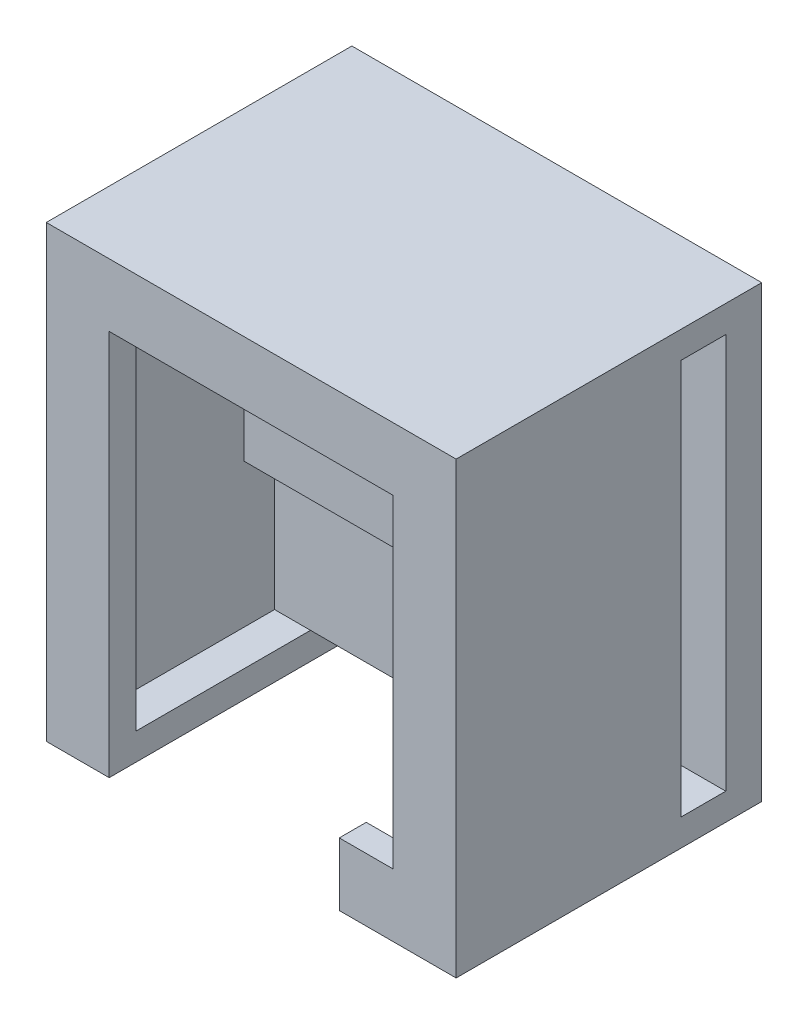
ISO-10303-21;
HEADER;
FILE_DESCRIPTION(('STEP AP214'),'2;1');
FILE_NAME('part.step','',(''),(''),'','','');
FILE_SCHEMA(('AUTOMOTIVE_DESIGN { 1 0 10303 214 1 1 1 1 }'));
ENDSEC;
DATA;
#1=APPLICATION_CONTEXT('core data for automotive mechanical design processes');
#2=APPLICATION_PROTOCOL_DEFINITION('international standard','automotive_design',2000,#1);
#3=PRODUCT_CONTEXT('',#1,'mechanical');
#4=PRODUCT('Part','Part','',(#3));
#5=PRODUCT_RELATED_PRODUCT_CATEGORY('part','',(#4));
#6=PRODUCT_DEFINITION_FORMATION('','',#4);
#7=PRODUCT_DEFINITION_CONTEXT('part definition',#1,'design');
#8=PRODUCT_DEFINITION('design','',#6,#7);
#9=PRODUCT_DEFINITION_SHAPE('','',#8);
#10=(LENGTH_UNIT() NAMED_UNIT(*) SI_UNIT(.MILLI.,.METRE.));
#11=(NAMED_UNIT(*) PLANE_ANGLE_UNIT() SI_UNIT($,.RADIAN.));
#12=(NAMED_UNIT(*) SI_UNIT($,.STERADIAN.) SOLID_ANGLE_UNIT());
#13=UNCERTAINTY_MEASURE_WITH_UNIT(LENGTH_MEASURE(1.E-05),#10,'distance_accuracy_value','');
#14=(GEOMETRIC_REPRESENTATION_CONTEXT(3) GLOBAL_UNCERTAINTY_ASSIGNED_CONTEXT((#13)) GLOBAL_UNIT_ASSIGNED_CONTEXT((#10,
#11,#12)) REPRESENTATION_CONTEXT('',''));
#15=CARTESIAN_POINT('',(0.,0.,0.));
#16=DIRECTION('',(0.,0.,1.));
#17=DIRECTION('',(1.,0.,0.));
#18=AXIS2_PLACEMENT_3D('',#15,#16,#17);
#19=CARTESIAN_POINT('',(-75.3066025977012,-5.31800766283525,3.));
#20=DIRECTION('',(0.,1.,0.));
#21=DIRECTION('',(0.,0.,1.));
#22=AXIS2_PLACEMENT_3D('',#19,#20,#21);
#23=PLANE('',#22);
#24=DIRECTION('',(0.,0.,1.));
#25=VECTOR('',#24,1.);
#26=CARTESIAN_POINT('',(-63.2066025977012,-5.31800766283525,11.));
#27=LINE('',#26,#25);
#28=CARTESIAN_POINT('',(-63.2066025977012,-5.31800766283527,0.));
#29=VERTEX_POINT('',#28);
#30=CARTESIAN_POINT('',(-63.2066025977012,-5.31800766283525,1.3));
#31=VERTEX_POINT('',#30);
#32=EDGE_CURVE('E352',#29,#31,#27,.T.);
#33=ORIENTED_EDGE('',*,*,#32,.F.);
#34=DIRECTION('',(1.,0.,0.));
#35=VECTOR('',#34,1.);
#36=CARTESIAN_POINT('',(-66.7066025977012,-5.31800766283527,0.));
#37=LINE('',#36,#35);
#38=CARTESIAN_POINT('',(-50.4066025977012,-5.31800766283526,0.));
#39=VERTEX_POINT('',#38);
#40=EDGE_CURVE('E214',#29,#39,#37,.T.);
#41=ORIENTED_EDGE('',*,*,#40,.T.);
#42=DIRECTION('',(0.,0.,-1.));
#43=VECTOR('',#42,1.);
#44=CARTESIAN_POINT('',(-50.4066025977012,-5.31800766283525,11.));
#45=LINE('',#44,#43);
#46=CARTESIAN_POINT('',(-50.4066025977012,-5.31800766283525,3.));
#47=VERTEX_POINT('',#46);
#48=EDGE_CURVE('E339',#47,#39,#45,.T.);
#49=ORIENTED_EDGE('',*,*,#48,.F.);
#50=DIRECTION('',(1.,0.,0.));
#51=VECTOR('',#50,1.);
#52=CARTESIAN_POINT('',(-75.3066025977012,-5.31800766283525,3.));
#53=LINE('',#52,#51);
#54=CARTESIAN_POINT('',(-52.2066025977012,-5.31800766283525,3.));
#55=VERTEX_POINT('',#54);
#56=EDGE_CURVE('E11',#55,#47,#53,.T.);
#57=ORIENTED_EDGE('',*,*,#56,.F.);
#58=DIRECTION('',(0.,0.,1.));
#59=VECTOR('',#58,1.);
#60=CARTESIAN_POINT('',(-52.2066025977012,-5.31800766283525,3.));
#61=LINE('',#60,#59);
#62=CARTESIAN_POINT('',(-52.2066025977012,-5.31800766283525,1.3));
#63=VERTEX_POINT('',#62);
#64=EDGE_CURVE('E359',#63,#55,#61,.T.);
#65=ORIENTED_EDGE('',*,*,#64,.F.);
#66=DIRECTION('',(1.,0.,0.));
#67=VECTOR('',#66,1.);
#68=CARTESIAN_POINT('',(-65.2066025977012,-5.31800766283525,1.3));
#69=LINE('',#68,#67);
#70=EDGE_CURVE('E348',#31,#63,#69,.T.);
#71=ORIENTED_EDGE('',*,*,#70,.F.);
#72=EDGE_LOOP('',(#33,#41,#49,#57,#65,#71));
#73=FACE_BOUND('',#72,.T.);
#74=ADVANCED_FACE('F33',(#73),#23,.F.);
#75=CARTESIAN_POINT('',(-50.4066025977012,-5.31800766283525,-2.5));
#76=VERTEX_POINT('',#75);
#77=CARTESIAN_POINT('',(-50.4066025977012,-5.31800766283525,-4.5));
#78=VERTEX_POINT('',#77);
#79=EDGE_CURVE('E336',#76,#78,#45,.T.);
#80=ORIENTED_EDGE('',*,*,#79,.F.);
#81=DIRECTION('',(1.,0.,0.));
#82=VECTOR('',#81,1.);
#83=CARTESIAN_POINT('',(-66.7066025977012,-5.31800766283527,-2.5));
#84=LINE('',#83,#82);
#85=CARTESIAN_POINT('',(-63.2066025977012,-5.31800766283527,-2.5));
#86=VERTEX_POINT('',#85);
#87=EDGE_CURVE('E249',#86,#76,#84,.T.);
#88=ORIENTED_EDGE('',*,*,#87,.F.);
#89=CARTESIAN_POINT('',(-63.2066025977012,-5.31800766283525,-4.5));
#90=VERTEX_POINT('',#89);
#91=EDGE_CURVE('E349',#90,#86,#27,.T.);
#92=ORIENTED_EDGE('',*,*,#91,.F.);
#93=DIRECTION('',(-1.,0.,0.));
#94=VECTOR('',#93,1.);
#95=CARTESIAN_POINT('',(-50.4066025977012,-5.31800766283525,-4.5));
#96=LINE('',#95,#94);
#97=EDGE_CURVE('E268',#78,#90,#96,.T.);
#98=ORIENTED_EDGE('',*,*,#97,.F.);
#99=EDGE_LOOP('',(#80,#88,#92,#98));
#100=FACE_BOUND('',#99,.T.);
#101=ADVANCED_FACE('F35',(#100),#23,.F.);
#102=CARTESIAN_POINT('',(-37.3066025977012,17.9596174955491,3.));
#103=DIRECTION('',(0.,0.,-1.));
#104=DIRECTION('',(-1.,0.,0.));
#105=AXIS2_PLACEMENT_3D('',#102,#103,#104);
#106=PLANE('',#105);
#107=DIRECTION('',(-1.,0.,0.));
#108=VECTOR('',#107,1.);
#109=CARTESIAN_POINT('',(-65.2066025977012,2.68199233716475,3.));
#110=LINE('',#109,#108);
#111=CARTESIAN_POINT('',(-52.2066025977012,2.68199233716475,3.));
#112=VERTEX_POINT('',#111);
#113=CARTESIAN_POINT('',(-65.2066025977012,2.68199233716475,3.));
#114=VERTEX_POINT('',#113);
#115=EDGE_CURVE('E365',#112,#114,#110,.T.);
#116=ORIENTED_EDGE('',*,*,#115,.F.);
#117=DIRECTION('',(0.,-1.,0.));
#118=VECTOR('',#117,1.);
#119=CARTESIAN_POINT('',(-52.2066025977012,2.68199233716475,3.));
#120=LINE('',#119,#118);
#121=EDGE_CURVE('E372',#112,#55,#120,.T.);
#122=ORIENTED_EDGE('',*,*,#121,.T.);
#123=ORIENTED_EDGE('',*,*,#56,.T.);
#124=DIRECTION('',(1.,0.,0.));
#125=VECTOR('',#124,1.);
#126=CARTESIAN_POINT('',(-37.3066025977012,-5.31800766283525,3.));
#127=LINE('',#126,#125);
#128=CARTESIAN_POINT('',(-45.4066025977012,-5.31800766283525,3.));
#129=VERTEX_POINT('',#128);
#130=EDGE_CURVE('E333',#47,#129,#127,.T.);
#131=ORIENTED_EDGE('',*,*,#130,.T.);
#132=DIRECTION('',(0.,-1.,0.));
#133=VECTOR('',#132,1.);
#134=CARTESIAN_POINT('',(-45.4066025977012,16.6819923371647,3.));
#135=LINE('',#134,#133);
#136=CARTESIAN_POINT('',(-45.4066025977012,16.6819923371647,3.));
#137=VERTEX_POINT('',#136);
#138=EDGE_CURVE('E385',#137,#129,#135,.T.);
#139=ORIENTED_EDGE('',*,*,#138,.F.);
#140=DIRECTION('',(1.,0.,0.));
#141=VECTOR('',#140,1.);
#142=CARTESIAN_POINT('',(-65.2066025977012,16.6819923371647,3.));
#143=LINE('',#142,#141);
#144=CARTESIAN_POINT('',(-65.2066025977012,16.6819923371647,3.));
#145=VERTEX_POINT('',#144);
#146=EDGE_CURVE('E393',#145,#137,#143,.T.);
#147=ORIENTED_EDGE('',*,*,#146,.F.);
#148=DIRECTION('',(0.,1.,0.));
#149=VECTOR('',#148,1.);
#150=CARTESIAN_POINT('',(-65.2066025977012,16.6819923371647,3.));
#151=LINE('',#150,#149);
#152=EDGE_CURVE('E375',#114,#145,#151,.T.);
#153=ORIENTED_EDGE('',*,*,#152,.F.);
#154=EDGE_LOOP('',(#116,#122,#123,#131,#139,#147,#153));
#155=FACE_BOUND('',#154,.T.);
#156=ADVANCED_FACE('F438',(#155),#106,.F.);
#157=CARTESIAN_POINT('',(-66.7066025977012,-5.31800766283525,11.));
#158=DIRECTION('',(1.,0.,0.));
#159=DIRECTION('',(0.,0.,-1.));
#160=AXIS2_PLACEMENT_3D('',#157,#158,#159);
#161=PLANE('',#160);
#162=DIRECTION('',(0.,0.,1.));
#163=VECTOR('',#162,1.);
#164=CARTESIAN_POINT('',(-66.7066025977012,16.6819923371647,0.));
#165=LINE('',#164,#163);
#166=CARTESIAN_POINT('',(-66.7066025977012,16.6819923371647,-2.5));
#167=VERTEX_POINT('',#166);
#168=CARTESIAN_POINT('',(-66.7066025977012,16.6819923371647,0.));
#169=VERTEX_POINT('',#168);
#170=EDGE_CURVE('E229',#167,#169,#165,.T.);
#171=ORIENTED_EDGE('',*,*,#170,.T.);
#172=DIRECTION('',(0.,-1.,0.));
#173=VECTOR('',#172,1.);
#174=CARTESIAN_POINT('',(-66.7066025977012,-5.31800766283527,0.));
#175=LINE('',#174,#173);
#176=CARTESIAN_POINT('',(-66.7066025977012,-5.31800766283527,0.));
#177=VERTEX_POINT('',#176);
#178=EDGE_CURVE('E211',#169,#177,#175,.T.);
#179=ORIENTED_EDGE('',*,*,#178,.T.);
#180=DIRECTION('',(0.,0.,-1.));
#181=VECTOR('',#180,1.);
#182=CARTESIAN_POINT('',(-66.7066025977012,-5.31800766283527,0.));
#183=LINE('',#182,#181);
#184=CARTESIAN_POINT('',(-66.7066025977012,-5.31800766283527,-2.5));
#185=VERTEX_POINT('',#184);
#186=EDGE_CURVE('E221',#177,#185,#183,.T.);
#187=ORIENTED_EDGE('',*,*,#186,.T.);
#188=DIRECTION('',(0.,1.,0.));
#189=VECTOR('',#188,1.);
#190=CARTESIAN_POINT('',(-66.7066025977012,-5.31800766283527,-2.5));
#191=LINE('',#190,#189);
#192=EDGE_CURVE('E48',#185,#167,#191,.T.);
#193=ORIENTED_EDGE('',*,*,#192,.T.);
#194=EDGE_LOOP('',(#171,#179,#187,#193));
#195=FACE_BOUND('',#194,.T.);
#196=DIRECTION('',(0.,0.,-1.));
#197=VECTOR('',#196,1.);
#198=CARTESIAN_POINT('',(-66.7066025977012,18.1819923371647,11.));
#199=LINE('',#198,#197);
#200=CARTESIAN_POINT('',(-66.7066025977012,18.1819923371647,12.5));
#201=VERTEX_POINT('',#200);
#202=CARTESIAN_POINT('',(-66.7066025977012,18.1819923371647,-4.5));
#203=VERTEX_POINT('',#202);
#204=EDGE_CURVE('E391',#201,#203,#199,.T.);
#205=ORIENTED_EDGE('',*,*,#204,.T.);
#206=DIRECTION('',(0.,1.,0.));
#207=VECTOR('',#206,1.);
#208=CARTESIAN_POINT('',(-66.7066025977012,-6.81800766283525,-4.5));
#209=LINE('',#208,#207);
#210=CARTESIAN_POINT('',(-66.7066025977012,-6.81800766283525,-4.5));
#211=VERTEX_POINT('',#210);
#212=EDGE_CURVE('E253',#211,#203,#209,.T.);
#213=ORIENTED_EDGE('',*,*,#212,.F.);
#214=DIRECTION('',(0.,0.,-1.));
#215=VECTOR('',#214,1.);
#216=CARTESIAN_POINT('',(-66.7066025977012,-6.81800766283525,11.));
#217=LINE('',#216,#215);
#218=CARTESIAN_POINT('',(-66.7066025977012,-6.81800766283525,12.5));
#219=VERTEX_POINT('',#218);
#220=EDGE_CURVE('E343',#219,#211,#217,.T.);
#221=ORIENTED_EDGE('',*,*,#220,.F.);
#222=DIRECTION('',(0.,-1.,0.));
#223=VECTOR('',#222,1.);
#224=CARTESIAN_POINT('',(-66.7066025977012,-6.81800766283525,12.5));
#225=LINE('',#224,#223);
#226=EDGE_CURVE('E300',#201,#219,#225,.T.);
#227=ORIENTED_EDGE('',*,*,#226,.F.);
#228=EDGE_LOOP('',(#205,#213,#221,#227));
#229=FACE_BOUND('',#228,.T.);
#230=ADVANCED_FACE('F226',(#195,#229),#161,.F.);
#231=CARTESIAN_POINT('',(-65.2066025977012,16.6819923371647,11.));
#232=DIRECTION('',(-1.,0.,0.));
#233=DIRECTION('',(0.,0.,1.));
#234=AXIS2_PLACEMENT_3D('',#231,#232,#233);
#235=PLANE('',#234);
#236=DIRECTION('',(0.,0.,-1.));
#237=VECTOR('',#236,1.);
#238=CARTESIAN_POINT('',(-65.2066025977012,-5.31800766283525,11.));
#239=LINE('',#238,#237);
#240=CARTESIAN_POINT('',(-65.2066025977012,-5.31800766283525,11.));
#241=VERTEX_POINT('',#240);
#242=CARTESIAN_POINT('',(-65.2066025977012,-5.31800766283525,1.3));
#243=VERTEX_POINT('',#242);
#244=EDGE_CURVE('E41',#241,#243,#239,.T.);
#245=ORIENTED_EDGE('',*,*,#244,.T.);
#246=DIRECTION('',(0.,-1.,0.));
#247=VECTOR('',#246,1.);
#248=CARTESIAN_POINT('',(-65.2066025977012,2.68199233716475,1.3));
#249=LINE('',#248,#247);
#250=CARTESIAN_POINT('',(-65.2066025977012,2.68199233716475,1.3));
#251=VERTEX_POINT('',#250);
#252=EDGE_CURVE('E367',#251,#243,#249,.T.);
#253=ORIENTED_EDGE('',*,*,#252,.F.);
#254=DIRECTION('',(0.,0.,-1.));
#255=VECTOR('',#254,1.);
#256=CARTESIAN_POINT('',(-65.2066025977012,2.68199233716475,3.));
#257=LINE('',#256,#255);
#258=EDGE_CURVE('E355',#114,#251,#257,.T.);
#259=ORIENTED_EDGE('',*,*,#258,.F.);
#260=ORIENTED_EDGE('',*,*,#152,.T.);
#261=DIRECTION('',(0.,0.,-1.));
#262=VECTOR('',#261,1.);
#263=CARTESIAN_POINT('',(-65.2066025977012,16.6819923371647,11.));
#264=LINE('',#263,#262);
#265=CARTESIAN_POINT('',(-65.2066025977012,16.6819923371647,11.));
#266=VERTEX_POINT('',#265);
#267=EDGE_CURVE('E406',#266,#145,#264,.T.);
#268=ORIENTED_EDGE('',*,*,#267,.F.);
#269=DIRECTION('',(0.,1.,0.));
#270=VECTOR('',#269,1.);
#271=CARTESIAN_POINT('',(-65.2066025977012,16.6819923371647,11.));
#272=LINE('',#271,#270);
#273=EDGE_CURVE('E381',#241,#266,#272,.T.);
#274=ORIENTED_EDGE('',*,*,#273,.F.);
#275=EDGE_LOOP('',(#245,#253,#259,#260,#268,#274));
#276=FACE_BOUND('',#275,.T.);
#277=ADVANCED_FACE('F410',(#276),#235,.F.);
#278=CARTESIAN_POINT('',(-65.2066025977012,16.6819923371647,11.));
#279=DIRECTION('',(0.,1.,0.));
#280=DIRECTION('',(0.,0.,1.));
#281=AXIS2_PLACEMENT_3D('',#278,#279,#280);
#282=PLANE('',#281);
#283=ORIENTED_EDGE('',*,*,#146,.T.);
#284=DIRECTION('',(0.,0.,-1.));
#285=VECTOR('',#284,1.);
#286=CARTESIAN_POINT('',(-45.4066025977012,16.6819923371647,11.));
#287=LINE('',#286,#285);
#288=CARTESIAN_POINT('',(-45.4066025977012,16.6819923371647,11.));
#289=VERTEX_POINT('',#288);
#290=EDGE_CURVE('E403',#289,#137,#287,.T.);
#291=ORIENTED_EDGE('',*,*,#290,.F.);
#292=DIRECTION('',(1.,0.,0.));
#293=VECTOR('',#292,1.);
#294=CARTESIAN_POINT('',(-65.2066025977012,16.6819923371647,11.));
#295=LINE('',#294,#293);
#296=EDGE_CURVE('E384',#266,#289,#295,.T.);
#297=ORIENTED_EDGE('',*,*,#296,.F.);
#298=ORIENTED_EDGE('',*,*,#267,.T.);
#299=EDGE_LOOP('',(#283,#291,#297,#298));
#300=FACE_BOUND('',#299,.T.);
#301=ADVANCED_FACE('F441',(#300),#282,.F.);
#302=CARTESIAN_POINT('',(-45.4066025977012,16.6819923371647,11.));
#303=DIRECTION('',(1.,0.,0.));
#304=DIRECTION('',(0.,0.,-1.));
#305=AXIS2_PLACEMENT_3D('',#302,#303,#304);
#306=PLANE('',#305);
#307=ORIENTED_EDGE('',*,*,#138,.T.);
#308=DIRECTION('',(0.,0.,-1.));
#309=VECTOR('',#308,1.);
#310=CARTESIAN_POINT('',(-45.4066025977012,-5.31800766283525,11.));
#311=LINE('',#310,#309);
#312=CARTESIAN_POINT('',(-45.4066025977012,-5.31800766283525,11.));
#313=VERTEX_POINT('',#312);
#314=EDGE_CURVE('E401',#313,#129,#311,.T.);
#315=ORIENTED_EDGE('',*,*,#314,.F.);
#316=DIRECTION('',(0.,-1.,0.));
#317=VECTOR('',#316,1.);
#318=CARTESIAN_POINT('',(-45.4066025977012,16.6819923371647,11.));
#319=LINE('',#318,#317);
#320=EDGE_CURVE('E388',#289,#313,#319,.T.);
#321=ORIENTED_EDGE('',*,*,#320,.F.);
#322=ORIENTED_EDGE('',*,*,#290,.T.);
#323=EDGE_LOOP('',(#307,#315,#321,#322));
#324=FACE_BOUND('',#323,.T.);
#325=ADVANCED_FACE('F507',(#324),#306,.F.);
#326=CARTESIAN_POINT('',(-43.9066025977012,-5.31800766283525,11.));
#327=DIRECTION('',(-1.,0.,0.));
#328=DIRECTION('',(0.,-1.,0.));
#329=AXIS2_PLACEMENT_3D('',#326,#327,#328);
#330=PLANE('',#329);
#331=DIRECTION('',(0.,0.,-1.));
#332=VECTOR('',#331,1.);
#333=CARTESIAN_POINT('',(-43.9066025977012,-5.31800766283525,0.));
#334=LINE('',#333,#332);
#335=CARTESIAN_POINT('',(-43.9066025977012,-5.31800766283525,0.));
#336=VERTEX_POINT('',#335);
#337=CARTESIAN_POINT('',(-43.9066025977012,-5.31800766283525,-2.5));
#338=VERTEX_POINT('',#337);
#339=EDGE_CURVE('E239',#336,#338,#334,.T.);
#340=ORIENTED_EDGE('',*,*,#339,.F.);
#341=DIRECTION('',(0.,-1.,0.));
#342=VECTOR('',#341,1.);
#343=CARTESIAN_POINT('',(-43.9066025977012,-5.31800766283525,0.));
#344=LINE('',#343,#342);
#345=CARTESIAN_POINT('',(-43.9066025977012,16.6819923371647,0.));
#346=VERTEX_POINT('',#345);
#347=EDGE_CURVE('E56',#346,#336,#344,.T.);
#348=ORIENTED_EDGE('',*,*,#347,.F.);
#349=DIRECTION('',(0.,0.,1.));
#350=VECTOR('',#349,1.);
#351=CARTESIAN_POINT('',(-43.9066025977012,16.6819923371647,0.));
#352=LINE('',#351,#350);
#353=CARTESIAN_POINT('',(-43.9066025977012,16.6819923371647,-2.5));
#354=VERTEX_POINT('',#353);
#355=EDGE_CURVE('E230',#354,#346,#352,.T.);
#356=ORIENTED_EDGE('',*,*,#355,.F.);
#357=DIRECTION('',(0.,1.,0.));
#358=VECTOR('',#357,1.);
#359=CARTESIAN_POINT('',(-43.9066025977012,-5.31800766283525,-2.5));
#360=LINE('',#359,#358);
#361=EDGE_CURVE('E233',#338,#354,#360,.T.);
#362=ORIENTED_EDGE('',*,*,#361,.F.);
#363=EDGE_LOOP('',(#340,#348,#356,#362));
#364=FACE_BOUND('',#363,.T.);
#365=DIRECTION('',(0.,0.,1.));
#366=VECTOR('',#365,1.);
#367=CARTESIAN_POINT('',(-43.9066025977012,-6.81800766283525,11.));
#368=LINE('',#367,#366);
#369=CARTESIAN_POINT('',(-43.9066025977012,-6.81800766283525,-4.5));
#370=VERTEX_POINT('',#369);
#371=CARTESIAN_POINT('',(-43.9066025977012,-6.81800766283525,12.5));
#372=VERTEX_POINT('',#371);
#373=EDGE_CURVE('E328',#370,#372,#368,.T.);
#374=ORIENTED_EDGE('',*,*,#373,.F.);
#375=DIRECTION('',(0.,-1.,0.));
#376=VECTOR('',#375,1.);
#377=CARTESIAN_POINT('',(-43.9066025977012,18.1819923371647,-4.5));
#378=LINE('',#377,#376);
#379=CARTESIAN_POINT('',(-43.9066025977012,18.1819923371647,-4.5));
#380=VERTEX_POINT('',#379);
#381=EDGE_CURVE('E259',#380,#370,#378,.T.);
#382=ORIENTED_EDGE('',*,*,#381,.F.);
#383=DIRECTION('',(0.,0.,-1.));
#384=VECTOR('',#383,1.);
#385=CARTESIAN_POINT('',(-43.9066025977012,18.1819923371647,11.));
#386=LINE('',#385,#384);
#387=CARTESIAN_POINT('',(-43.9066025977012,18.1819923371647,12.5));
#388=VERTEX_POINT('',#387);
#389=EDGE_CURVE('E399',#388,#380,#386,.T.);
#390=ORIENTED_EDGE('',*,*,#389,.F.);
#391=DIRECTION('',(0.,1.,0.));
#392=VECTOR('',#391,1.);
#393=CARTESIAN_POINT('',(-43.9066025977012,18.1819923371647,12.5));
#394=LINE('',#393,#392);
#395=EDGE_CURVE('E294',#372,#388,#394,.T.);
#396=ORIENTED_EDGE('',*,*,#395,.F.);
#397=EDGE_LOOP('',(#374,#382,#390,#396));
#398=FACE_BOUND('',#397,.T.);
#399=ADVANCED_FACE('F478',(#364,#398),#330,.F.);
#400=CARTESIAN_POINT('',(-66.7066025977012,18.1819923371647,11.));
#401=DIRECTION('',(0.,-1.,0.));
#402=DIRECTION('',(1.,0.,0.));
#403=AXIS2_PLACEMENT_3D('',#400,#401,#402);
#404=PLANE('',#403);
#405=ORIENTED_EDGE('',*,*,#389,.T.);
#406=DIRECTION('',(1.,0.,0.));
#407=VECTOR('',#406,1.);
#408=CARTESIAN_POINT('',(-66.7066025977012,18.1819923371647,-4.5));
#409=LINE('',#408,#407);
#410=EDGE_CURVE('E256',#203,#380,#409,.T.);
#411=ORIENTED_EDGE('',*,*,#410,.F.);
#412=ORIENTED_EDGE('',*,*,#204,.F.);
#413=DIRECTION('',(-1.,0.,0.));
#414=VECTOR('',#413,1.);
#415=CARTESIAN_POINT('',(-66.7066025977012,18.1819923371647,12.5));
#416=LINE('',#415,#414);
#417=EDGE_CURVE('E297',#388,#201,#416,.T.);
#418=ORIENTED_EDGE('',*,*,#417,.F.);
#419=EDGE_LOOP('',(#405,#411,#412,#418));
#420=FACE_BOUND('',#419,.T.);
#421=ADVANCED_FACE('F513',(#420),#404,.F.);
#422=CARTESIAN_POINT('',(-52.2066025977012,2.68199233716475,3.));
#423=DIRECTION('',(1.,0.,0.));
#424=DIRECTION('',(0.,0.,-1.));
#425=AXIS2_PLACEMENT_3D('',#422,#423,#424);
#426=PLANE('',#425);
#427=ORIENTED_EDGE('',*,*,#64,.T.);
#428=ORIENTED_EDGE('',*,*,#121,.F.);
#429=DIRECTION('',(0.,0.,1.));
#430=VECTOR('',#429,1.);
#431=CARTESIAN_POINT('',(-52.2066025977012,2.68199233716475,3.));
#432=LINE('',#431,#430);
#433=CARTESIAN_POINT('',(-52.2066025977012,2.68199233716475,1.3));
#434=VERTEX_POINT('',#433);
#435=EDGE_CURVE('E362',#434,#112,#432,.T.);
#436=ORIENTED_EDGE('',*,*,#435,.F.);
#437=DIRECTION('',(0.,-1.,0.));
#438=VECTOR('',#437,1.);
#439=CARTESIAN_POINT('',(-52.2066025977012,2.68199233716475,1.3));
#440=LINE('',#439,#438);
#441=EDGE_CURVE('E376',#434,#63,#440,.T.);
#442=ORIENTED_EDGE('',*,*,#441,.T.);
#443=EDGE_LOOP('',(#427,#428,#436,#442));
#444=FACE_BOUND('',#443,.T.);
#445=ADVANCED_FACE('F431',(#444),#426,.F.);
#446=CARTESIAN_POINT('',(-65.2066025977012,2.68199233716475,1.3));
#447=DIRECTION('',(0.,0.,-1.));
#448=DIRECTION('',(-1.,0.,0.));
#449=AXIS2_PLACEMENT_3D('',#446,#447,#448);
#450=PLANE('',#449);
#451=EDGE_CURVE('E368',#243,#31,#69,.T.);
#452=ORIENTED_EDGE('',*,*,#451,.T.);
#453=ORIENTED_EDGE('',*,*,#70,.T.);
#454=ORIENTED_EDGE('',*,*,#441,.F.);
#455=DIRECTION('',(1.,0.,0.));
#456=VECTOR('',#455,1.);
#457=CARTESIAN_POINT('',(-65.2066025977012,2.68199233716475,1.3));
#458=LINE('',#457,#456);
#459=EDGE_CURVE('E358',#251,#434,#458,.T.);
#460=ORIENTED_EDGE('',*,*,#459,.F.);
#461=ORIENTED_EDGE('',*,*,#252,.T.);
#462=EDGE_LOOP('',(#452,#453,#454,#460,#461));
#463=FACE_BOUND('',#462,.T.);
#464=ADVANCED_FACE('F417',(#463),#450,.F.);
#465=CARTESIAN_POINT('',(0.,2.68199233716475,0.));
#466=DIRECTION('',(0.,-1.,0.));
#467=DIRECTION('',(0.,0.,-1.));
#468=AXIS2_PLACEMENT_3D('',#465,#466,#467);
#469=PLANE('',#468);
#470=ORIENTED_EDGE('',*,*,#258,.T.);
#471=ORIENTED_EDGE('',*,*,#459,.T.);
#472=ORIENTED_EDGE('',*,*,#435,.T.);
#473=ORIENTED_EDGE('',*,*,#115,.T.);
#474=EDGE_LOOP('',(#470,#471,#472,#473));
#475=FACE_BOUND('',#474,.T.);
#476=ADVANCED_FACE('F434',(#475),#469,.T.);
#477=CARTESIAN_POINT('',(-63.2066025977012,-6.81800766283525,11.));
#478=DIRECTION('',(-1.,0.,0.));
#479=DIRECTION('',(0.,0.,1.));
#480=AXIS2_PLACEMENT_3D('',#477,#478,#479);
#481=PLANE('',#480);
#482=ORIENTED_EDGE('',*,*,#91,.T.);
#483=DIRECTION('',(0.,0.,1.));
#484=VECTOR('',#483,1.);
#485=CARTESIAN_POINT('',(-63.2066025977012,-5.31800766283527,11.));
#486=LINE('',#485,#484);
#487=EDGE_CURVE('E246',#86,#29,#486,.T.);
#488=ORIENTED_EDGE('',*,*,#487,.T.);
#489=ORIENTED_EDGE('',*,*,#32,.T.);
#490=CARTESIAN_POINT('',(-63.2066025977012,-5.31800766283525,11.));
#491=VERTEX_POINT('',#490);
#492=EDGE_CURVE('E342',#31,#491,#27,.T.);
#493=ORIENTED_EDGE('',*,*,#492,.T.);
#494=DIRECTION('',(0.,1.,0.));
#495=VECTOR('',#494,1.);
#496=CARTESIAN_POINT('',(-63.2066025977012,-5.31800766283525,11.));
#497=LINE('',#496,#495);
#498=CARTESIAN_POINT('',(-63.2066025977012,14.6819923371647,11.));
#499=VERTEX_POINT('',#498);
#500=EDGE_CURVE('E282',#491,#499,#497,.T.);
#501=ORIENTED_EDGE('',*,*,#500,.T.);
#502=DIRECTION('',(0.,0.,-1.));
#503=VECTOR('',#502,1.);
#504=CARTESIAN_POINT('',(-63.2066025977012,14.6819923371647,12.5));
#505=LINE('',#504,#503);
#506=CARTESIAN_POINT('',(-63.2066025977012,14.6819923371647,12.5));
#507=VERTEX_POINT('',#506);
#508=EDGE_CURVE('E324',#507,#499,#505,.T.);
#509=ORIENTED_EDGE('',*,*,#508,.F.);
#510=DIRECTION('',(0.,1.,0.));
#511=VECTOR('',#510,1.);
#512=CARTESIAN_POINT('',(-63.2066025977012,14.6819923371647,12.5));
#513=LINE('',#512,#511);
#514=CARTESIAN_POINT('',(-63.2066025977012,-6.81800766283525,12.5));
#515=VERTEX_POINT('',#514);
#516=EDGE_CURVE('E278',#515,#507,#513,.T.);
#517=ORIENTED_EDGE('',*,*,#516,.F.);
#518=DIRECTION('',(0.,0.,1.));
#519=VECTOR('',#518,1.);
#520=CARTESIAN_POINT('',(-63.2066025977012,-6.81800766283525,11.));
#521=LINE('',#520,#519);
#522=CARTESIAN_POINT('',(-63.2066025977012,-6.81800766283525,-4.5));
#523=VERTEX_POINT('',#522);
#524=EDGE_CURVE('E345',#523,#515,#521,.T.);
#525=ORIENTED_EDGE('',*,*,#524,.F.);
#526=DIRECTION('',(0.,-1.,0.));
#527=VECTOR('',#526,1.);
#528=CARTESIAN_POINT('',(-63.2066025977012,-5.31800766283525,-4.5));
#529=LINE('',#528,#527);
#530=EDGE_CURVE('E271',#90,#523,#529,.T.);
#531=ORIENTED_EDGE('',*,*,#530,.F.);
#532=EDGE_LOOP('',(#482,#488,#489,#493,#501,#509,#517,#525,#531));
#533=FACE_BOUND('',#532,.T.);
#534=ADVANCED_FACE('F423',(#533),#481,.F.);
#535=CARTESIAN_POINT('',(0.,-6.81800766283525,0.));
#536=DIRECTION('',(0.,-1.,0.));
#537=DIRECTION('',(0.,0.,-1.));
#538=AXIS2_PLACEMENT_3D('',#535,#536,#537);
#539=PLANE('',#538);
#540=ORIENTED_EDGE('',*,*,#220,.T.);
#541=DIRECTION('',(-1.,0.,0.));
#542=VECTOR('',#541,1.);
#543=CARTESIAN_POINT('',(-63.2066025977012,-6.81800766283525,-4.5));
#544=LINE('',#543,#542);
#545=EDGE_CURVE('E274',#523,#211,#544,.T.);
#546=ORIENTED_EDGE('',*,*,#545,.F.);
#547=ORIENTED_EDGE('',*,*,#524,.T.);
#548=DIRECTION('',(1.,0.,0.));
#549=VECTOR('',#548,1.);
#550=CARTESIAN_POINT('',(-63.2066025977012,-6.81800766283525,12.5));
#551=LINE('',#550,#549);
#552=EDGE_CURVE('E303',#219,#515,#551,.T.);
#553=ORIENTED_EDGE('',*,*,#552,.F.);
#554=EDGE_LOOP('',(#540,#546,#547,#553));
#555=FACE_BOUND('',#554,.T.);
#556=ADVANCED_FACE('F458',(#555),#539,.T.);
#557=CARTESIAN_POINT('',(0.,-5.31800766283525,0.));
#558=DIRECTION('',(0.,-1.,0.));
#559=DIRECTION('',(0.,0.,-1.));
#560=AXIS2_PLACEMENT_3D('',#557,#558,#559);
#561=PLANE('',#560);
#562=ORIENTED_EDGE('',*,*,#451,.F.);
#563=ORIENTED_EDGE('',*,*,#244,.F.);
#564=DIRECTION('',(-1.,0.,0.));
#565=VECTOR('',#564,1.);
#566=CARTESIAN_POINT('',(-66.7066025977012,-5.31800766283525,11.));
#567=LINE('',#566,#565);
#568=EDGE_CURVE('E346',#491,#241,#567,.T.);
#569=ORIENTED_EDGE('',*,*,#568,.F.);
#570=ORIENTED_EDGE('',*,*,#492,.F.);
#571=EDGE_LOOP('',(#562,#563,#569,#570));
#572=FACE_BOUND('',#571,.T.);
#573=ADVANCED_FACE('F420',(#572),#561,.F.);
#574=CARTESIAN_POINT('',(0.,-5.31800766283525,0.));
#575=DIRECTION('',(0.,1.,0.));
#576=DIRECTION('',(0.,0.,1.));
#577=AXIS2_PLACEMENT_3D('',#574,#575,#576);
#578=PLANE('',#577);
#579=ORIENTED_EDGE('',*,*,#130,.F.);
#580=CARTESIAN_POINT('',(-50.4066025977012,-5.31800766283525,11.));
#581=VERTEX_POINT('',#580);
#582=EDGE_CURVE('E331',#581,#47,#45,.T.);
#583=ORIENTED_EDGE('',*,*,#582,.F.);
#584=DIRECTION('',(-1.,0.,0.));
#585=VECTOR('',#584,1.);
#586=CARTESIAN_POINT('',(-43.9066025977012,-5.31800766283525,11.));
#587=LINE('',#586,#585);
#588=EDGE_CURVE('E327',#313,#581,#587,.T.);
#589=ORIENTED_EDGE('',*,*,#588,.F.);
#590=ORIENTED_EDGE('',*,*,#314,.T.);
#591=EDGE_LOOP('',(#579,#583,#589,#590));
#592=FACE_BOUND('',#591,.T.);
#593=ADVANCED_FACE('F527',(#592),#578,.T.);
#594=CARTESIAN_POINT('',(-50.4066025977012,-6.81800766283525,11.));
#595=DIRECTION('',(1.,0.,0.));
#596=DIRECTION('',(0.,0.,-1.));
#597=AXIS2_PLACEMENT_3D('',#594,#595,#596);
#598=PLANE('',#597);
#599=ORIENTED_EDGE('',*,*,#582,.T.);
#600=ORIENTED_EDGE('',*,*,#48,.T.);
#601=EDGE_CURVE('E812',#39,#76,#45,.T.);
#602=ORIENTED_EDGE('',*,*,#601,.T.);
#603=ORIENTED_EDGE('',*,*,#79,.T.);
#604=DIRECTION('',(0.,1.,0.));
#605=VECTOR('',#604,1.);
#606=CARTESIAN_POINT('',(-50.4066025977012,-6.81800766283525,-4.5));
#607=LINE('',#606,#605);
#608=CARTESIAN_POINT('',(-50.4066025977012,-6.81800766283525,-4.5));
#609=VERTEX_POINT('',#608);
#610=EDGE_CURVE('E265',#609,#78,#607,.T.);
#611=ORIENTED_EDGE('',*,*,#610,.F.);
#612=DIRECTION('',(0.,0.,-1.));
#613=VECTOR('',#612,1.);
#614=CARTESIAN_POINT('',(-50.4066025977012,-6.81800766283525,11.));
#615=LINE('',#614,#613);
#616=CARTESIAN_POINT('',(-50.4066025977012,-6.81800766283525,12.5));
#617=VERTEX_POINT('',#616);
#618=EDGE_CURVE('E330',#617,#609,#615,.T.);
#619=ORIENTED_EDGE('',*,*,#618,.F.);
#620=DIRECTION('',(0.,-1.,0.));
#621=VECTOR('',#620,1.);
#622=CARTESIAN_POINT('',(-50.4066025977012,-6.81800766283525,12.5));
#623=LINE('',#622,#621);
#624=CARTESIAN_POINT('',(-50.4066025977012,-3.31800766283525,12.5));
#625=VERTEX_POINT('',#624);
#626=EDGE_CURVE('E288',#625,#617,#623,.T.);
#627=ORIENTED_EDGE('',*,*,#626,.F.);
#628=DIRECTION('',(0.,0.,-1.));
#629=VECTOR('',#628,1.);
#630=CARTESIAN_POINT('',(-50.4066025977012,-3.31800766283525,12.5));
#631=LINE('',#630,#629);
#632=CARTESIAN_POINT('',(-50.4066025977012,-3.31800766283525,11.));
#633=VERTEX_POINT('',#632);
#634=EDGE_CURVE('E306',#625,#633,#631,.T.);
#635=ORIENTED_EDGE('',*,*,#634,.T.);
#636=DIRECTION('',(0.,-1.,0.));
#637=VECTOR('',#636,1.);
#638=CARTESIAN_POINT('',(-50.4066025977012,-6.81800766283525,11.));
#639=LINE('',#638,#637);
#640=EDGE_CURVE('E312',#633,#581,#639,.T.);
#641=ORIENTED_EDGE('',*,*,#640,.T.);
#642=EDGE_LOOP('',(#599,#600,#602,#603,#611,#619,#627,#635,#641));
#643=FACE_BOUND('',#642,.T.);
#644=ADVANCED_FACE('F530',(#643),#598,.F.);
#645=CARTESIAN_POINT('',(0.,-6.81800766283525,0.));
#646=DIRECTION('',(0.,1.,0.));
#647=DIRECTION('',(0.,0.,1.));
#648=AXIS2_PLACEMENT_3D('',#645,#646,#647);
#649=PLANE('',#648);
#650=ORIENTED_EDGE('',*,*,#373,.T.);
#651=DIRECTION('',(1.,0.,0.));
#652=VECTOR('',#651,1.);
#653=CARTESIAN_POINT('',(-43.9066025977012,-6.81800766283525,12.5));
#654=LINE('',#653,#652);
#655=EDGE_CURVE('E291',#617,#372,#654,.T.);
#656=ORIENTED_EDGE('',*,*,#655,.F.);
#657=ORIENTED_EDGE('',*,*,#618,.T.);
#658=DIRECTION('',(-1.,0.,0.));
#659=VECTOR('',#658,1.);
#660=CARTESIAN_POINT('',(-43.9066025977012,-6.81800766283525,-4.5));
#661=LINE('',#660,#659);
#662=EDGE_CURVE('E262',#370,#609,#661,.T.);
#663=ORIENTED_EDGE('',*,*,#662,.F.);
#664=EDGE_LOOP('',(#650,#656,#657,#663));
#665=FACE_BOUND('',#664,.T.);
#666=ADVANCED_FACE('F533',(#665),#649,.F.);
#667=CARTESIAN_POINT('',(-47.4066025977012,14.6819923371647,12.5));
#668=DIRECTION('',(0.,1.,0.));
#669=DIRECTION('',(0.,0.,1.));
#670=AXIS2_PLACEMENT_3D('',#667,#668,#669);
#671=PLANE('',#670);
#672=DIRECTION('',(1.,0.,0.));
#673=VECTOR('',#672,1.);
#674=CARTESIAN_POINT('',(-47.4066025977012,14.6819923371647,11.));
#675=LINE('',#674,#673);
#676=CARTESIAN_POINT('',(-47.4066025977012,14.6819923371647,11.));
#677=VERTEX_POINT('',#676);
#678=EDGE_CURVE('E277',#499,#677,#675,.T.);
#679=ORIENTED_EDGE('',*,*,#678,.T.);
#680=DIRECTION('',(0.,0.,-1.));
#681=VECTOR('',#680,1.);
#682=CARTESIAN_POINT('',(-47.4066025977012,14.6819923371647,12.5));
#683=LINE('',#682,#681);
#684=CARTESIAN_POINT('',(-47.4066025977012,14.6819923371647,12.5));
#685=VERTEX_POINT('',#684);
#686=EDGE_CURVE('E321',#685,#677,#683,.T.);
#687=ORIENTED_EDGE('',*,*,#686,.F.);
#688=DIRECTION('',(1.,0.,0.));
#689=VECTOR('',#688,1.);
#690=CARTESIAN_POINT('',(-47.4066025977012,14.6819923371647,12.5));
#691=LINE('',#690,#689);
#692=EDGE_CURVE('E281',#507,#685,#691,.T.);
#693=ORIENTED_EDGE('',*,*,#692,.F.);
#694=ORIENTED_EDGE('',*,*,#508,.T.);
#695=EDGE_LOOP('',(#679,#687,#693,#694));
#696=FACE_BOUND('',#695,.T.);
#697=ADVANCED_FACE('F450',(#696),#671,.F.);
#698=CARTESIAN_POINT('',(-47.4066025977012,-3.31800766283525,12.5));
#699=DIRECTION('',(1.,0.,0.));
#700=DIRECTION('',(0.,0.,-1.));
#701=AXIS2_PLACEMENT_3D('',#698,#699,#700);
#702=PLANE('',#701);
#703=DIRECTION('',(0.,-1.,0.));
#704=VECTOR('',#703,1.);
#705=CARTESIAN_POINT('',(-47.4066025977012,-3.31800766283525,11.));
#706=LINE('',#705,#704);
#707=CARTESIAN_POINT('',(-47.4066025977012,-3.31800766283525,11.));
#708=VERTEX_POINT('',#707);
#709=EDGE_CURVE('E308',#677,#708,#706,.T.);
#710=ORIENTED_EDGE('',*,*,#709,.T.);
#711=DIRECTION('',(0.,0.,-1.));
#712=VECTOR('',#711,1.);
#713=CARTESIAN_POINT('',(-47.4066025977012,-3.31800766283525,12.5));
#714=LINE('',#713,#712);
#715=CARTESIAN_POINT('',(-47.4066025977012,-3.31800766283525,12.5));
#716=VERTEX_POINT('',#715);
#717=EDGE_CURVE('E318',#716,#708,#714,.T.);
#718=ORIENTED_EDGE('',*,*,#717,.F.);
#719=DIRECTION('',(0.,-1.,0.));
#720=VECTOR('',#719,1.);
#721=CARTESIAN_POINT('',(-47.4066025977012,-3.31800766283525,12.5));
#722=LINE('',#721,#720);
#723=EDGE_CURVE('E284',#685,#716,#722,.T.);
#724=ORIENTED_EDGE('',*,*,#723,.F.);
#725=ORIENTED_EDGE('',*,*,#686,.T.);
#726=EDGE_LOOP('',(#710,#718,#724,#725));
#727=FACE_BOUND('',#726,.T.);
#728=ADVANCED_FACE('F543',(#727),#702,.F.);
#729=CARTESIAN_POINT('',(-50.4066025977012,-3.31800766283525,12.5));
#730=DIRECTION('',(0.,-1.,0.));
#731=DIRECTION('',(0.,0.,-1.));
#732=AXIS2_PLACEMENT_3D('',#729,#730,#731);
#733=PLANE('',#732);
#734=DIRECTION('',(-1.,0.,0.));
#735=VECTOR('',#734,1.);
#736=CARTESIAN_POINT('',(-50.4066025977012,-3.31800766283525,11.));
#737=LINE('',#736,#735);
#738=EDGE_CURVE('E310',#708,#633,#737,.T.);
#739=ORIENTED_EDGE('',*,*,#738,.T.);
#740=ORIENTED_EDGE('',*,*,#634,.F.);
#741=DIRECTION('',(-1.,0.,0.));
#742=VECTOR('',#741,1.);
#743=CARTESIAN_POINT('',(-50.4066025977012,-3.31800766283525,12.5));
#744=LINE('',#743,#742);
#745=EDGE_CURVE('E286',#716,#625,#744,.T.);
#746=ORIENTED_EDGE('',*,*,#745,.F.);
#747=ORIENTED_EDGE('',*,*,#717,.T.);
#748=EDGE_LOOP('',(#739,#740,#746,#747));
#749=FACE_BOUND('',#748,.T.);
#750=ADVANCED_FACE('F546',(#749),#733,.F.);
#751=CARTESIAN_POINT('',(0.,0.,12.5));
#752=DIRECTION('',(0.,0.,-1.));
#753=DIRECTION('',(-1.,0.,0.));
#754=AXIS2_PLACEMENT_3D('',#751,#752,#753);
#755=PLANE('',#754);
#756=ORIENTED_EDGE('',*,*,#516,.T.);
#757=ORIENTED_EDGE('',*,*,#692,.T.);
#758=ORIENTED_EDGE('',*,*,#723,.T.);
#759=ORIENTED_EDGE('',*,*,#745,.T.);
#760=ORIENTED_EDGE('',*,*,#626,.T.);
#761=ORIENTED_EDGE('',*,*,#655,.T.);
#762=ORIENTED_EDGE('',*,*,#395,.T.);
#763=ORIENTED_EDGE('',*,*,#417,.T.);
#764=ORIENTED_EDGE('',*,*,#226,.T.);
#765=ORIENTED_EDGE('',*,*,#552,.T.);
#766=EDGE_LOOP('',(#756,#757,#758,#759,#760,#761,#762,#763,#764,#765));
#767=FACE_BOUND('',#766,.T.);
#768=ADVANCED_FACE('F454',(#767),#755,.F.);
#769=CARTESIAN_POINT('',(0.,0.,11.));
#770=DIRECTION('',(0.,0.,-1.));
#771=DIRECTION('',(-1.,0.,0.));
#772=AXIS2_PLACEMENT_3D('',#769,#770,#771);
#773=PLANE('',#772);
#774=ORIENTED_EDGE('',*,*,#500,.F.);
#775=ORIENTED_EDGE('',*,*,#568,.T.);
#776=ORIENTED_EDGE('',*,*,#273,.T.);
#777=ORIENTED_EDGE('',*,*,#296,.T.);
#778=ORIENTED_EDGE('',*,*,#320,.T.);
#779=ORIENTED_EDGE('',*,*,#588,.T.);
#780=ORIENTED_EDGE('',*,*,#640,.F.);
#781=ORIENTED_EDGE('',*,*,#738,.F.);
#782=ORIENTED_EDGE('',*,*,#709,.F.);
#783=ORIENTED_EDGE('',*,*,#678,.F.);
#784=EDGE_LOOP('',(#774,#775,#776,#777,#778,#779,#780,#781,#782,#783));
#785=FACE_BOUND('',#784,.T.);
#786=ADVANCED_FACE('F444',(#785),#773,.T.);
#787=CARTESIAN_POINT('',(0.,0.,-4.5));
#788=DIRECTION('',(0.,0.,-1.));
#789=DIRECTION('',(-1.,0.,0.));
#790=AXIS2_PLACEMENT_3D('',#787,#788,#789);
#791=PLANE('',#790);
#792=ORIENTED_EDGE('',*,*,#212,.T.);
#793=ORIENTED_EDGE('',*,*,#410,.T.);
#794=ORIENTED_EDGE('',*,*,#381,.T.);
#795=ORIENTED_EDGE('',*,*,#662,.T.);
#796=ORIENTED_EDGE('',*,*,#610,.T.);
#797=ORIENTED_EDGE('',*,*,#97,.T.);
#798=ORIENTED_EDGE('',*,*,#530,.T.);
#799=ORIENTED_EDGE('',*,*,#545,.T.);
#800=EDGE_LOOP('',(#792,#793,#794,#795,#796,#797,#798,#799));
#801=FACE_BOUND('',#800,.T.);
#802=ADVANCED_FACE('F462',(#801),#791,.T.);
#803=CARTESIAN_POINT('',(-66.7066025977012,-5.31800766283527,0.));
#804=DIRECTION('',(0.,-1.,0.));
#805=DIRECTION('',(1.,0.,0.));
#806=AXIS2_PLACEMENT_3D('',#803,#804,#805);
#807=PLANE('',#806);
#808=EDGE_CURVE('E223',#185,#86,#84,.T.);
#809=ORIENTED_EDGE('',*,*,#808,.F.);
#810=ORIENTED_EDGE('',*,*,#186,.F.);
#811=EDGE_CURVE('E207',#177,#29,#37,.T.);
#812=ORIENTED_EDGE('',*,*,#811,.T.);
#813=ORIENTED_EDGE('',*,*,#487,.F.);
#814=EDGE_LOOP('',(#809,#810,#812,#813));
#815=FACE_BOUND('',#814,.T.);
#816=ADVANCED_FACE('F222',(#815),#807,.F.);
#817=EDGE_CURVE('E219',#39,#336,#37,.T.);
#818=ORIENTED_EDGE('',*,*,#817,.T.);
#819=ORIENTED_EDGE('',*,*,#339,.T.);
#820=EDGE_CURVE('E217',#76,#338,#84,.T.);
#821=ORIENTED_EDGE('',*,*,#820,.F.);
#822=ORIENTED_EDGE('',*,*,#601,.F.);
#823=EDGE_LOOP('',(#818,#819,#821,#822));
#824=FACE_BOUND('',#823,.T.);
#825=ADVANCED_FACE('F476',(#824),#807,.F.);
#826=CARTESIAN_POINT('',(-66.7066025977012,-5.31800766283527,0.));
#827=DIRECTION('',(0.,0.,1.));
#828=DIRECTION('',(1.,0.,0.));
#829=AXIS2_PLACEMENT_3D('',#826,#827,#828);
#830=PLANE('',#829);
#831=ORIENTED_EDGE('',*,*,#347,.T.);
#832=ORIENTED_EDGE('',*,*,#817,.F.);
#833=ORIENTED_EDGE('',*,*,#40,.F.);
#834=ORIENTED_EDGE('',*,*,#811,.F.);
#835=ORIENTED_EDGE('',*,*,#178,.F.);
#836=DIRECTION('',(1.,0.,0.));
#837=VECTOR('',#836,1.);
#838=CARTESIAN_POINT('',(-66.7066025977012,16.6819923371647,0.));
#839=LINE('',#838,#837);
#840=EDGE_CURVE('E244',#169,#346,#839,.T.);
#841=ORIENTED_EDGE('',*,*,#840,.T.);
#842=EDGE_LOOP('',(#831,#832,#833,#834,#835,#841));
#843=FACE_BOUND('',#842,.T.);
#844=ADVANCED_FACE('F209',(#843),#830,.F.);
#845=CARTESIAN_POINT('',(-66.7066025977012,16.6819923371647,0.));
#846=DIRECTION('',(0.,1.,0.));
#847=DIRECTION('',(-1.,0.,0.));
#848=AXIS2_PLACEMENT_3D('',#845,#846,#847);
#849=PLANE('',#848);
#850=ORIENTED_EDGE('',*,*,#355,.T.);
#851=ORIENTED_EDGE('',*,*,#840,.F.);
#852=ORIENTED_EDGE('',*,*,#170,.F.);
#853=DIRECTION('',(1.,0.,0.));
#854=VECTOR('',#853,1.);
#855=CARTESIAN_POINT('',(-66.7066025977012,16.6819923371647,-2.5));
#856=LINE('',#855,#854);
#857=EDGE_CURVE('E247',#167,#354,#856,.T.);
#858=ORIENTED_EDGE('',*,*,#857,.T.);
#859=EDGE_LOOP('',(#850,#851,#852,#858));
#860=FACE_BOUND('',#859,.T.);
#861=ADVANCED_FACE('F481',(#860),#849,.F.);
#862=CARTESIAN_POINT('',(-66.7066025977012,-5.31800766283527,-2.5));
#863=DIRECTION('',(0.,0.,-1.));
#864=DIRECTION('',(-1.,0.,0.));
#865=AXIS2_PLACEMENT_3D('',#862,#863,#864);
#866=PLANE('',#865);
#867=ORIENTED_EDGE('',*,*,#361,.T.);
#868=ORIENTED_EDGE('',*,*,#857,.F.);
#869=ORIENTED_EDGE('',*,*,#192,.F.);
#870=ORIENTED_EDGE('',*,*,#808,.T.);
#871=ORIENTED_EDGE('',*,*,#87,.T.);
#872=ORIENTED_EDGE('',*,*,#820,.T.);
#873=EDGE_LOOP('',(#867,#868,#869,#870,#871,#872));
#874=FACE_BOUND('',#873,.T.);
#875=ADVANCED_FACE('F471',(#874),#866,.F.);
#876=CLOSED_SHELL('',(#74,#101,#156,#230,#277,#301,#325,#399,#421,#445,#464,#476,#534,#556,#573,
#593,#644,#666,#697,#728,#750,#768,#786,#802,#816,#825,#844,#861,#875));
#877=MANIFOLD_SOLID_BREP('B2',#876);
#878=ADVANCED_BREP_SHAPE_REPRESENTATION('',(#18,#877),#14);
#879=SHAPE_DEFINITION_REPRESENTATION(#9,#878);
ENDSEC;
END-ISO-10303-21;
